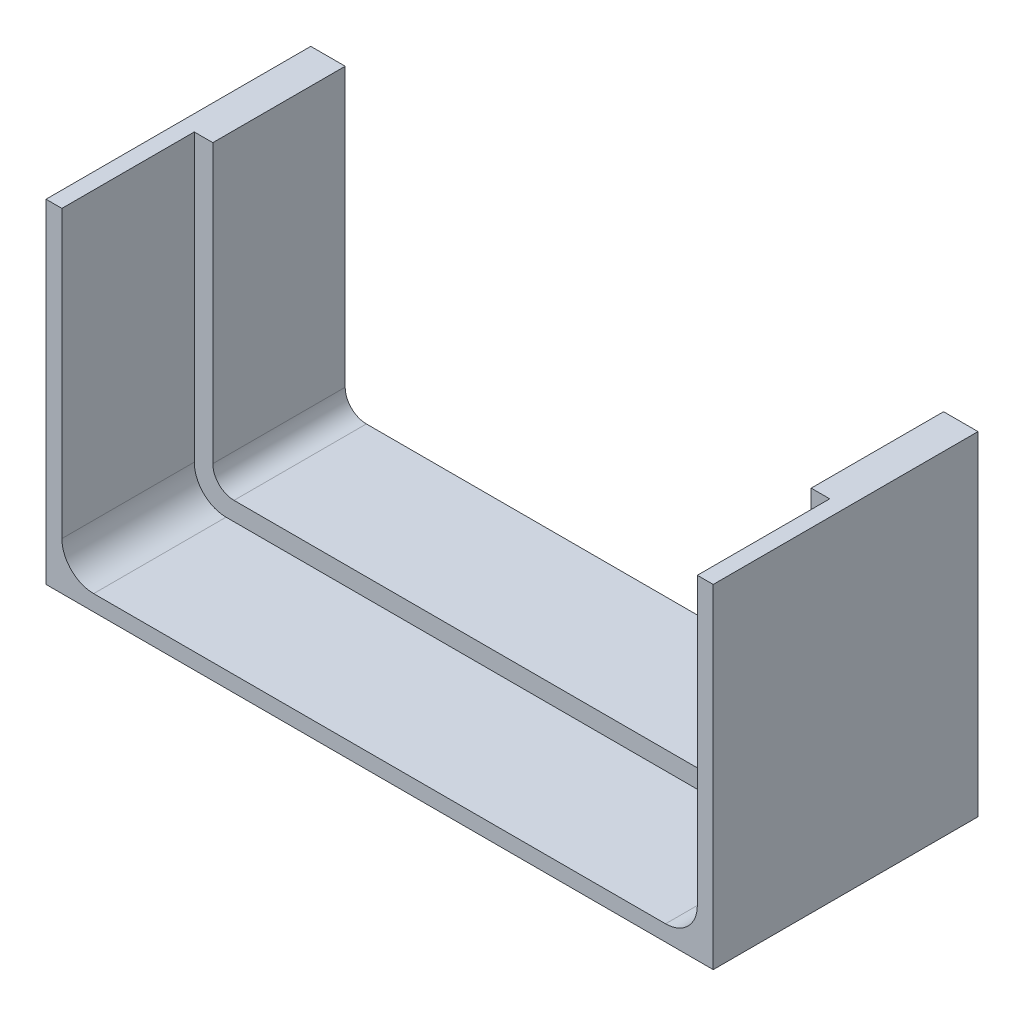
ISO-10303-21;
HEADER;
FILE_DESCRIPTION(('STEP AP214'),'2;1');
FILE_NAME('part.step','',(''),(''),'','','');
FILE_SCHEMA(('AUTOMOTIVE_DESIGN { 1 0 10303 214 1 1 1 1 }'));
ENDSEC;
DATA;
#1=APPLICATION_CONTEXT('core data for automotive mechanical design processes');
#2=APPLICATION_PROTOCOL_DEFINITION('international standard','automotive_design',2000,#1);
#3=PRODUCT_CONTEXT('',#1,'mechanical');
#4=PRODUCT('Part','Part','',(#3));
#5=PRODUCT_RELATED_PRODUCT_CATEGORY('part','',(#4));
#6=PRODUCT_DEFINITION_FORMATION('','',#4);
#7=PRODUCT_DEFINITION_CONTEXT('part definition',#1,'design');
#8=PRODUCT_DEFINITION('design','',#6,#7);
#9=PRODUCT_DEFINITION_SHAPE('','',#8);
#10=(LENGTH_UNIT() NAMED_UNIT(*) SI_UNIT(.MILLI.,.METRE.));
#11=(NAMED_UNIT(*) PLANE_ANGLE_UNIT() SI_UNIT($,.RADIAN.));
#12=(NAMED_UNIT(*) SI_UNIT($,.STERADIAN.) SOLID_ANGLE_UNIT());
#13=UNCERTAINTY_MEASURE_WITH_UNIT(LENGTH_MEASURE(1.E-05),#10,'distance_accuracy_value','');
#14=(GEOMETRIC_REPRESENTATION_CONTEXT(3) GLOBAL_UNCERTAINTY_ASSIGNED_CONTEXT((#13)) GLOBAL_UNIT_ASSIGNED_CONTEXT((#10,
#11,#12)) REPRESENTATION_CONTEXT('',''));
#15=CARTESIAN_POINT('',(0.,0.,0.));
#16=DIRECTION('',(0.,0.,1.));
#17=DIRECTION('',(1.,0.,0.));
#18=AXIS2_PLACEMENT_3D('',#15,#16,#17);
#19=CARTESIAN_POINT('',(-62.9999999999999,-63.,25.));
#20=DIRECTION('',(1.,0.,0.));
#21=DIRECTION('',(0.,0.,-1.));
#22=AXIS2_PLACEMENT_3D('',#19,#20,#21);
#23=PLANE('',#22);
#24=DIRECTION('',(0.,0.,-1.));
#25=VECTOR('',#24,1.);
#26=CARTESIAN_POINT('',(-62.9999999999999,0.,25.));
#27=LINE('',#26,#25);
#28=CARTESIAN_POINT('',(-62.9999999999999,0.,25.));
#29=VERTEX_POINT('',#28);
#30=CARTESIAN_POINT('',(-62.9999999999999,0.,-25.));
#31=VERTEX_POINT('',#30);
#32=EDGE_CURVE('E162',#29,#31,#27,.T.);
#33=ORIENTED_EDGE('',*,*,#32,.T.);
#34=DIRECTION('',(0.,1.,0.));
#35=VECTOR('',#34,1.);
#36=CARTESIAN_POINT('',(-62.9999999999999,-63.,-25.));
#37=LINE('',#36,#35);
#38=CARTESIAN_POINT('',(-62.9999999999999,-63.,-25.));
#39=VERTEX_POINT('',#38);
#40=EDGE_CURVE('E160',#39,#31,#37,.T.);
#41=ORIENTED_EDGE('',*,*,#40,.F.);
#42=DIRECTION('',(0.,0.,-1.));
#43=VECTOR('',#42,1.);
#44=CARTESIAN_POINT('',(-62.9999999999999,-63.,25.));
#45=LINE('',#44,#43);
#46=CARTESIAN_POINT('',(-62.9999999999999,-63.,25.));
#47=VERTEX_POINT('',#46);
#48=EDGE_CURVE('E146',#47,#39,#45,.T.);
#49=ORIENTED_EDGE('',*,*,#48,.F.);
#50=DIRECTION('',(0.,-1.,0.));
#51=VECTOR('',#50,1.);
#52=CARTESIAN_POINT('',(-62.9999999999999,-63.,25.));
#53=LINE('',#52,#51);
#54=EDGE_CURVE('E204',#29,#47,#53,.T.);
#55=ORIENTED_EDGE('',*,*,#54,.F.);
#56=EDGE_LOOP('',(#33,#41,#49,#55));
#57=FACE_BOUND('',#56,.T.);
#58=ADVANCED_FACE('F33',(#57),#23,.F.);
#59=CARTESIAN_POINT('',(62.9999999999999,-63.,25.));
#60=DIRECTION('',(0.,1.,0.));
#61=DIRECTION('',(-1.,0.,0.));
#62=AXIS2_PLACEMENT_3D('',#59,#60,#61);
#63=PLANE('',#62);
#64=ORIENTED_EDGE('',*,*,#48,.T.);
#65=DIRECTION('',(-1.,0.,0.));
#66=VECTOR('',#65,1.);
#67=CARTESIAN_POINT('',(62.9999999999999,-63.,-25.));
#68=LINE('',#67,#66);
#69=CARTESIAN_POINT('',(62.9999999999999,-63.,-25.));
#70=VERTEX_POINT('',#69);
#71=EDGE_CURVE('E151',#70,#39,#68,.T.);
#72=ORIENTED_EDGE('',*,*,#71,.F.);
#73=DIRECTION('',(0.,0.,-1.));
#74=VECTOR('',#73,1.);
#75=CARTESIAN_POINT('',(62.9999999999999,-63.,25.));
#76=LINE('',#75,#74);
#77=CARTESIAN_POINT('',(62.9999999999999,-63.,25.));
#78=VERTEX_POINT('',#77);
#79=EDGE_CURVE('E157',#78,#70,#76,.T.);
#80=ORIENTED_EDGE('',*,*,#79,.F.);
#81=DIRECTION('',(1.,0.,0.));
#82=VECTOR('',#81,1.);
#83=CARTESIAN_POINT('',(62.9999999999999,-63.,25.));
#84=LINE('',#83,#82);
#85=EDGE_CURVE('E152',#47,#78,#84,.T.);
#86=ORIENTED_EDGE('',*,*,#85,.F.);
#87=EDGE_LOOP('',(#64,#72,#80,#86));
#88=FACE_BOUND('',#87,.T.);
#89=ADVANCED_FACE('F148',(#88),#63,.F.);
#90=CARTESIAN_POINT('',(62.9999999999999,0.,25.));
#91=DIRECTION('',(-1.,0.,0.));
#92=DIRECTION('',(0.,-1.,0.));
#93=AXIS2_PLACEMENT_3D('',#90,#91,#92);
#94=PLANE('',#93);
#95=ORIENTED_EDGE('',*,*,#79,.T.);
#96=DIRECTION('',(0.,-1.,0.));
#97=VECTOR('',#96,1.);
#98=CARTESIAN_POINT('',(62.9999999999999,0.,-25.));
#99=LINE('',#98,#97);
#100=CARTESIAN_POINT('',(62.9999999999999,0.,-25.));
#101=VERTEX_POINT('',#100);
#102=EDGE_CURVE('E171',#101,#70,#99,.T.);
#103=ORIENTED_EDGE('',*,*,#102,.F.);
#104=DIRECTION('',(0.,0.,-1.));
#105=VECTOR('',#104,1.);
#106=CARTESIAN_POINT('',(62.9999999999999,0.,25.));
#107=LINE('',#106,#105);
#108=CARTESIAN_POINT('',(62.9999999999999,0.,25.));
#109=VERTEX_POINT('',#108);
#110=EDGE_CURVE('E236',#109,#101,#107,.T.);
#111=ORIENTED_EDGE('',*,*,#110,.F.);
#112=DIRECTION('',(0.,1.,0.));
#113=VECTOR('',#112,1.);
#114=CARTESIAN_POINT('',(62.9999999999999,0.,25.));
#115=LINE('',#114,#113);
#116=EDGE_CURVE('E208',#78,#109,#115,.T.);
#117=ORIENTED_EDGE('',*,*,#116,.F.);
#118=EDGE_LOOP('',(#95,#103,#111,#117));
#119=FACE_BOUND('',#118,.T.);
#120=ADVANCED_FACE('F322',(#119),#94,.F.);
#121=CARTESIAN_POINT('',(60.,0.,25.));
#122=DIRECTION('',(0.,-1.,0.));
#123=DIRECTION('',(1.,0.,0.));
#124=AXIS2_PLACEMENT_3D('',#121,#122,#123);
#125=PLANE('',#124);
#126=ORIENTED_EDGE('',*,*,#110,.T.);
#127=DIRECTION('',(1.,0.,0.));
#128=VECTOR('',#127,1.);
#129=CARTESIAN_POINT('',(56.4999999999999,0.,-25.));
#130=LINE('',#129,#128);
#131=CARTESIAN_POINT('',(56.4999999999999,0.,-25.));
#132=VERTEX_POINT('',#131);
#133=EDGE_CURVE('E186',#132,#101,#130,.T.);
#134=ORIENTED_EDGE('',*,*,#133,.F.);
#135=DIRECTION('',(0.,0.,1.));
#136=VECTOR('',#135,1.);
#137=CARTESIAN_POINT('',(56.4999999999999,0.,-25.));
#138=LINE('',#137,#136);
#139=CARTESIAN_POINT('',(56.4999999999999,0.,0.));
#140=VERTEX_POINT('',#139);
#141=EDGE_CURVE('E189',#132,#140,#138,.T.);
#142=ORIENTED_EDGE('',*,*,#141,.T.);
#143=DIRECTION('',(1.,0.,0.));
#144=VECTOR('',#143,1.);
#145=CARTESIAN_POINT('',(56.4999999999999,0.,0.));
#146=LINE('',#145,#144);
#147=CARTESIAN_POINT('',(60.,0.,0.));
#148=VERTEX_POINT('',#147);
#149=EDGE_CURVE('E172',#140,#148,#146,.T.);
#150=ORIENTED_EDGE('',*,*,#149,.T.);
#151=DIRECTION('',(0.,0.,-1.));
#152=VECTOR('',#151,1.);
#153=CARTESIAN_POINT('',(60.,0.,25.));
#154=LINE('',#153,#152);
#155=CARTESIAN_POINT('',(60.,0.,25.));
#156=VERTEX_POINT('',#155);
#157=EDGE_CURVE('E233',#156,#148,#154,.T.);
#158=ORIENTED_EDGE('',*,*,#157,.F.);
#159=DIRECTION('',(-1.,0.,0.));
#160=VECTOR('',#159,1.);
#161=CARTESIAN_POINT('',(60.,0.,25.));
#162=LINE('',#161,#160);
#163=EDGE_CURVE('E210',#109,#156,#162,.T.);
#164=ORIENTED_EDGE('',*,*,#163,.F.);
#165=EDGE_LOOP('',(#126,#134,#142,#150,#158,#164));
#166=FACE_BOUND('',#165,.T.);
#167=ADVANCED_FACE('F319',(#166),#125,.F.);
#168=CARTESIAN_POINT('',(60.,-60.,25.));
#169=DIRECTION('',(1.,0.,0.));
#170=DIRECTION('',(0.,1.,0.));
#171=AXIS2_PLACEMENT_3D('',#168,#169,#170);
#172=PLANE('',#171);
#173=DIRECTION('',(0.,-1.,0.));
#174=VECTOR('',#173,1.);
#175=CARTESIAN_POINT('',(60.,-60.,0.));
#176=LINE('',#175,#174);
#177=CARTESIAN_POINT('',(60.,-54.,0.));
#178=VERTEX_POINT('',#177);
#179=EDGE_CURVE('E203',#148,#178,#176,.T.);
#180=ORIENTED_EDGE('',*,*,#179,.T.);
#181=DIRECTION('',(0.,0.,-1.));
#182=VECTOR('',#181,1.);
#183=CARTESIAN_POINT('',(60.,-54.,25.));
#184=LINE('',#183,#182);
#185=CARTESIAN_POINT('',(60.,-54.,25.));
#186=VERTEX_POINT('',#185);
#187=EDGE_CURVE('E243',#178,#186,#184,.F.);
#188=ORIENTED_EDGE('',*,*,#187,.T.);
#189=DIRECTION('',(0.,-1.,0.));
#190=VECTOR('',#189,1.);
#191=CARTESIAN_POINT('',(60.,-60.,25.));
#192=LINE('',#191,#190);
#193=EDGE_CURVE('E212',#156,#186,#192,.T.);
#194=ORIENTED_EDGE('',*,*,#193,.F.);
#195=ORIENTED_EDGE('',*,*,#157,.T.);
#196=EDGE_LOOP('',(#180,#188,#194,#195));
#197=FACE_BOUND('',#196,.T.);
#198=ADVANCED_FACE('F314',(#197),#172,.F.);
#199=CARTESIAN_POINT('',(-60.,-60.,25.));
#200=DIRECTION('',(0.,-1.,0.));
#201=DIRECTION('',(1.,0.,0.));
#202=AXIS2_PLACEMENT_3D('',#199,#200,#201);
#203=PLANE('',#202);
#204=DIRECTION('',(-1.,0.,0.));
#205=VECTOR('',#204,1.);
#206=CARTESIAN_POINT('',(-60.,-60.,25.));
#207=LINE('',#206,#205);
#208=CARTESIAN_POINT('',(54.,-60.,25.));
#209=VERTEX_POINT('',#208);
#210=CARTESIAN_POINT('',(-54.,-60.,25.));
#211=VERTEX_POINT('',#210);
#212=EDGE_CURVE('E215',#209,#211,#207,.T.);
#213=ORIENTED_EDGE('',*,*,#212,.F.);
#214=DIRECTION('',(0.,0.,-1.));
#215=VECTOR('',#214,1.);
#216=CARTESIAN_POINT('',(54.,-60.,0.));
#217=LINE('',#216,#215);
#218=CARTESIAN_POINT('',(54.,-60.,0.));
#219=VERTEX_POINT('',#218);
#220=EDGE_CURVE('E240',#209,#219,#217,.T.);
#221=ORIENTED_EDGE('',*,*,#220,.T.);
#222=DIRECTION('',(-1.,0.,0.));
#223=VECTOR('',#222,1.);
#224=CARTESIAN_POINT('',(-60.,-60.,0.));
#225=LINE('',#224,#223);
#226=CARTESIAN_POINT('',(-54.,-60.,0.));
#227=VERTEX_POINT('',#226);
#228=EDGE_CURVE('E224',#219,#227,#225,.T.);
#229=ORIENTED_EDGE('',*,*,#228,.T.);
#230=DIRECTION('',(0.,0.,-1.));
#231=VECTOR('',#230,1.);
#232=CARTESIAN_POINT('',(-54.,-60.,25.));
#233=LINE('',#232,#231);
#234=EDGE_CURVE('E156',#227,#211,#233,.F.);
#235=ORIENTED_EDGE('',*,*,#234,.T.);
#236=EDGE_LOOP('',(#213,#221,#229,#235));
#237=FACE_BOUND('',#236,.T.);
#238=ADVANCED_FACE('F307',(#237),#203,.F.);
#239=CARTESIAN_POINT('',(-60.,0.,25.));
#240=DIRECTION('',(-1.,0.,0.));
#241=DIRECTION('',(0.,-1.,0.));
#242=AXIS2_PLACEMENT_3D('',#239,#240,#241);
#243=PLANE('',#242);
#244=DIRECTION('',(0.,1.,0.));
#245=VECTOR('',#244,1.);
#246=CARTESIAN_POINT('',(-60.,0.,25.));
#247=LINE('',#246,#245);
#248=CARTESIAN_POINT('',(-60.,-54.,25.));
#249=VERTEX_POINT('',#248);
#250=CARTESIAN_POINT('',(-60.,0.,25.));
#251=VERTEX_POINT('',#250);
#252=EDGE_CURVE('E218',#249,#251,#247,.T.);
#253=ORIENTED_EDGE('',*,*,#252,.F.);
#254=DIRECTION('',(0.,0.,-1.));
#255=VECTOR('',#254,1.);
#256=CARTESIAN_POINT('',(-60.,-54.,0.));
#257=LINE('',#256,#255);
#258=CARTESIAN_POINT('',(-60.,-54.,0.));
#259=VERTEX_POINT('',#258);
#260=EDGE_CURVE('E245',#249,#259,#257,.T.);
#261=ORIENTED_EDGE('',*,*,#260,.T.);
#262=DIRECTION('',(0.,1.,0.));
#263=VECTOR('',#262,1.);
#264=CARTESIAN_POINT('',(-60.,0.,0.));
#265=LINE('',#264,#263);
#266=CARTESIAN_POINT('',(-60.,0.,0.));
#267=VERTEX_POINT('',#266);
#268=EDGE_CURVE('E206',#259,#267,#265,.T.);
#269=ORIENTED_EDGE('',*,*,#268,.T.);
#270=DIRECTION('',(0.,0.,-1.));
#271=VECTOR('',#270,1.);
#272=CARTESIAN_POINT('',(-60.,0.,25.));
#273=LINE('',#272,#271);
#274=EDGE_CURVE('E230',#251,#267,#273,.T.);
#275=ORIENTED_EDGE('',*,*,#274,.F.);
#276=EDGE_LOOP('',(#253,#261,#269,#275));
#277=FACE_BOUND('',#276,.T.);
#278=ADVANCED_FACE('F294',(#277),#243,.F.);
#279=CARTESIAN_POINT('',(-62.9999999999999,0.,25.));
#280=DIRECTION('',(0.,-1.,0.));
#281=DIRECTION('',(0.,0.,-1.));
#282=AXIS2_PLACEMENT_3D('',#279,#280,#281);
#283=PLANE('',#282);
#284=ORIENTED_EDGE('',*,*,#274,.T.);
#285=DIRECTION('',(1.,0.,0.));
#286=VECTOR('',#285,1.);
#287=CARTESIAN_POINT('',(-62.9999999999999,0.,0.));
#288=LINE('',#287,#286);
#289=CARTESIAN_POINT('',(-56.4999999999999,0.,0.));
#290=VERTEX_POINT('',#289);
#291=EDGE_CURVE('E190',#267,#290,#288,.T.);
#292=ORIENTED_EDGE('',*,*,#291,.T.);
#293=DIRECTION('',(0.,0.,1.));
#294=VECTOR('',#293,1.);
#295=CARTESIAN_POINT('',(-56.4999999999999,0.,-25.));
#296=LINE('',#295,#294);
#297=CARTESIAN_POINT('',(-56.4999999999999,0.,-25.));
#298=VERTEX_POINT('',#297);
#299=EDGE_CURVE('E200',#298,#290,#296,.T.);
#300=ORIENTED_EDGE('',*,*,#299,.F.);
#301=DIRECTION('',(1.,0.,0.));
#302=VECTOR('',#301,1.);
#303=CARTESIAN_POINT('',(-62.9999999999999,0.,-25.));
#304=LINE('',#303,#302);
#305=EDGE_CURVE('E165',#31,#298,#304,.T.);
#306=ORIENTED_EDGE('',*,*,#305,.F.);
#307=ORIENTED_EDGE('',*,*,#32,.F.);
#308=DIRECTION('',(-1.,0.,0.));
#309=VECTOR('',#308,1.);
#310=CARTESIAN_POINT('',(-62.9999999999999,0.,25.));
#311=LINE('',#310,#309);
#312=EDGE_CURVE('E220',#251,#29,#311,.T.);
#313=ORIENTED_EDGE('',*,*,#312,.F.);
#314=EDGE_LOOP('',(#284,#292,#300,#306,#307,#313));
#315=FACE_BOUND('',#314,.T.);
#316=ADVANCED_FACE('F297',(#315),#283,.F.);
#317=CARTESIAN_POINT('',(0.,0.,25.));
#318=DIRECTION('',(0.,0.,-1.));
#319=DIRECTION('',(-1.,0.,0.));
#320=AXIS2_PLACEMENT_3D('',#317,#318,#319);
#321=PLANE('',#320);
#322=ORIENTED_EDGE('',*,*,#54,.T.);
#323=ORIENTED_EDGE('',*,*,#85,.T.);
#324=ORIENTED_EDGE('',*,*,#116,.T.);
#325=ORIENTED_EDGE('',*,*,#163,.T.);
#326=ORIENTED_EDGE('',*,*,#193,.T.);
#327=CARTESIAN_POINT('',(54.,-54.,25.));
#328=DIRECTION('',(0.,0.,-1.));
#329=DIRECTION('',(-1.,0.,0.));
#330=AXIS2_PLACEMENT_3D('',#327,#328,#329);
#331=CIRCLE('',#330,6.);
#332=EDGE_CURVE('E250',#186,#209,#331,.T.);
#333=ORIENTED_EDGE('',*,*,#332,.T.);
#334=ORIENTED_EDGE('',*,*,#212,.T.);
#335=CARTESIAN_POINT('',(-54.,-54.,25.));
#336=DIRECTION('',(0.,0.,-1.));
#337=DIRECTION('',(-1.,0.,0.));
#338=AXIS2_PLACEMENT_3D('',#335,#336,#337);
#339=CIRCLE('',#338,6.);
#340=EDGE_CURVE('E254',#211,#249,#339,.T.);
#341=ORIENTED_EDGE('',*,*,#340,.T.);
#342=ORIENTED_EDGE('',*,*,#252,.T.);
#343=ORIENTED_EDGE('',*,*,#312,.T.);
#344=EDGE_LOOP('',(#322,#323,#324,#325,#326,#333,#334,#341,#342,#343));
#345=FACE_BOUND('',#344,.T.);
#346=ADVANCED_FACE('F299',(#345),#321,.F.);
#347=CARTESIAN_POINT('',(54.,-54.,25.));
#348=DIRECTION('',(0.,0.,1.));
#349=DIRECTION('',(1.,0.,0.));
#350=AXIS2_PLACEMENT_3D('',#347,#348,#349);
#351=CYLINDRICAL_SURFACE('',#350,6.);
#352=ORIENTED_EDGE('',*,*,#332,.F.);
#353=ORIENTED_EDGE('',*,*,#187,.F.);
#354=CARTESIAN_POINT('',(54.,-54.,0.));
#355=DIRECTION('',(0.,0.,-1.));
#356=DIRECTION('',(-1.,0.,0.));
#357=AXIS2_PLACEMENT_3D('',#354,#355,#356);
#358=CIRCLE('',#357,6.);
#359=EDGE_CURVE('E248',#219,#178,#358,.F.);
#360=ORIENTED_EDGE('',*,*,#359,.F.);
#361=ORIENTED_EDGE('',*,*,#220,.F.);
#362=EDGE_LOOP('',(#352,#353,#360,#361));
#363=FACE_BOUND('',#362,.T.);
#364=ADVANCED_FACE('F311',(#363),#351,.F.);
#365=CARTESIAN_POINT('',(-54.,-54.,25.));
#366=DIRECTION('',(0.,0.,1.));
#367=DIRECTION('',(1.,0.,0.));
#368=AXIS2_PLACEMENT_3D('',#365,#366,#367);
#369=CYLINDRICAL_SURFACE('',#368,6.);
#370=ORIENTED_EDGE('',*,*,#340,.F.);
#371=ORIENTED_EDGE('',*,*,#234,.F.);
#372=CARTESIAN_POINT('',(-54.,-54.,0.));
#373=DIRECTION('',(0.,0.,-1.));
#374=DIRECTION('',(-1.,0.,0.));
#375=AXIS2_PLACEMENT_3D('',#372,#373,#374);
#376=CIRCLE('',#375,6.);
#377=EDGE_CURVE('E252',#259,#227,#376,.F.);
#378=ORIENTED_EDGE('',*,*,#377,.F.);
#379=ORIENTED_EDGE('',*,*,#260,.F.);
#380=EDGE_LOOP('',(#370,#371,#378,#379));
#381=FACE_BOUND('',#380,.T.);
#382=ADVANCED_FACE('F302',(#381),#369,.F.);
#383=CARTESIAN_POINT('',(-56.4999999999999,0.,-25.));
#384=DIRECTION('',(-1.,0.,0.));
#385=DIRECTION('',(0.,-1.,0.));
#386=AXIS2_PLACEMENT_3D('',#383,#384,#385);
#387=PLANE('',#386);
#388=DIRECTION('',(0.,-1.,0.));
#389=VECTOR('',#388,1.);
#390=CARTESIAN_POINT('',(-56.4999999999999,0.,0.));
#391=LINE('',#390,#389);
#392=CARTESIAN_POINT('',(-56.5,-52.5,0.));
#393=VERTEX_POINT('',#392);
#394=EDGE_CURVE('E192',#290,#393,#391,.T.);
#395=ORIENTED_EDGE('',*,*,#394,.T.);
#396=DIRECTION('',(0.,0.,1.));
#397=VECTOR('',#396,1.);
#398=CARTESIAN_POINT('',(-56.5,-52.5,-25.));
#399=LINE('',#398,#397);
#400=CARTESIAN_POINT('',(-56.5,-52.5,-25.));
#401=VERTEX_POINT('',#400);
#402=EDGE_CURVE('E48',#393,#401,#399,.F.);
#403=ORIENTED_EDGE('',*,*,#402,.T.);
#404=DIRECTION('',(0.,-1.,0.));
#405=VECTOR('',#404,1.);
#406=CARTESIAN_POINT('',(-56.4999999999999,0.,-25.));
#407=LINE('',#406,#405);
#408=EDGE_CURVE('E179',#298,#401,#407,.T.);
#409=ORIENTED_EDGE('',*,*,#408,.F.);
#410=ORIENTED_EDGE('',*,*,#299,.T.);
#411=EDGE_LOOP('',(#395,#403,#409,#410));
#412=FACE_BOUND('',#411,.T.);
#413=ADVANCED_FACE('F288',(#412),#387,.F.);
#414=CARTESIAN_POINT('',(-56.5,-56.5,-25.));
#415=DIRECTION('',(0.,-1.,0.));
#416=DIRECTION('',(1.,0.,0.));
#417=AXIS2_PLACEMENT_3D('',#414,#415,#416);
#418=PLANE('',#417);
#419=DIRECTION('',(1.,0.,0.));
#420=VECTOR('',#419,1.);
#421=CARTESIAN_POINT('',(-56.5,-56.5,0.));
#422=LINE('',#421,#420);
#423=CARTESIAN_POINT('',(-52.5,-56.5,0.));
#424=VERTEX_POINT('',#423);
#425=CARTESIAN_POINT('',(52.4999999999999,-56.5,0.));
#426=VERTEX_POINT('',#425);
#427=EDGE_CURVE('E194',#424,#426,#422,.T.);
#428=ORIENTED_EDGE('',*,*,#427,.T.);
#429=DIRECTION('',(0.,0.,1.));
#430=VECTOR('',#429,1.);
#431=CARTESIAN_POINT('',(52.4999999999999,-56.5,-25.));
#432=LINE('',#431,#430);
#433=CARTESIAN_POINT('',(52.4999999999999,-56.5,-25.));
#434=VERTEX_POINT('',#433);
#435=EDGE_CURVE('E262',#426,#434,#432,.F.);
#436=ORIENTED_EDGE('',*,*,#435,.T.);
#437=DIRECTION('',(1.,0.,0.));
#438=VECTOR('',#437,1.);
#439=CARTESIAN_POINT('',(-56.5,-56.5,-25.));
#440=LINE('',#439,#438);
#441=CARTESIAN_POINT('',(-52.5,-56.5,-25.));
#442=VERTEX_POINT('',#441);
#443=EDGE_CURVE('E181',#442,#434,#440,.T.);
#444=ORIENTED_EDGE('',*,*,#443,.F.);
#445=DIRECTION('',(0.,0.,1.));
#446=VECTOR('',#445,1.);
#447=CARTESIAN_POINT('',(-52.5,-56.5,0.));
#448=LINE('',#447,#446);
#449=EDGE_CURVE('E259',#442,#424,#448,.T.);
#450=ORIENTED_EDGE('',*,*,#449,.T.);
#451=EDGE_LOOP('',(#428,#436,#444,#450));
#452=FACE_BOUND('',#451,.T.);
#453=ADVANCED_FACE('F283',(#452),#418,.F.);
#454=CARTESIAN_POINT('',(56.4999999999999,-56.5,-25.));
#455=DIRECTION('',(1.,0.,0.));
#456=DIRECTION('',(0.,1.,0.));
#457=AXIS2_PLACEMENT_3D('',#454,#455,#456);
#458=PLANE('',#457);
#459=DIRECTION('',(0.,1.,0.));
#460=VECTOR('',#459,1.);
#461=CARTESIAN_POINT('',(56.4999999999999,-56.5,-25.));
#462=LINE('',#461,#460);
#463=CARTESIAN_POINT('',(56.4999999999999,-52.5,-25.));
#464=VERTEX_POINT('',#463);
#465=EDGE_CURVE('E184',#464,#132,#462,.T.);
#466=ORIENTED_EDGE('',*,*,#465,.F.);
#467=DIRECTION('',(0.,0.,1.));
#468=VECTOR('',#467,1.);
#469=CARTESIAN_POINT('',(56.4999999999999,-52.5,0.));
#470=LINE('',#469,#468);
#471=CARTESIAN_POINT('',(56.4999999999999,-52.5,0.));
#472=VERTEX_POINT('',#471);
#473=EDGE_CURVE('E256',#464,#472,#470,.T.);
#474=ORIENTED_EDGE('',*,*,#473,.T.);
#475=DIRECTION('',(0.,1.,0.));
#476=VECTOR('',#475,1.);
#477=CARTESIAN_POINT('',(56.4999999999999,-56.5,0.));
#478=LINE('',#477,#476);
#479=EDGE_CURVE('E175',#472,#140,#478,.T.);
#480=ORIENTED_EDGE('',*,*,#479,.T.);
#481=ORIENTED_EDGE('',*,*,#141,.F.);
#482=EDGE_LOOP('',(#466,#474,#480,#481));
#483=FACE_BOUND('',#482,.T.);
#484=ADVANCED_FACE('F276',(#483),#458,.F.);
#485=CARTESIAN_POINT('',(0.,0.,-25.));
#486=DIRECTION('',(0.,0.,-1.));
#487=DIRECTION('',(-1.,0.,0.));
#488=AXIS2_PLACEMENT_3D('',#485,#486,#487);
#489=PLANE('',#488);
#490=ORIENTED_EDGE('',*,*,#71,.T.);
#491=ORIENTED_EDGE('',*,*,#40,.T.);
#492=ORIENTED_EDGE('',*,*,#305,.T.);
#493=ORIENTED_EDGE('',*,*,#408,.T.);
#494=CARTESIAN_POINT('',(-52.5,-52.5,-25.));
#495=DIRECTION('',(0.,0.,-1.));
#496=DIRECTION('',(-1.,0.,0.));
#497=AXIS2_PLACEMENT_3D('',#494,#495,#496);
#498=CIRCLE('',#497,4.);
#499=EDGE_CURVE('E11',#401,#442,#498,.F.);
#500=ORIENTED_EDGE('',*,*,#499,.T.);
#501=ORIENTED_EDGE('',*,*,#443,.T.);
#502=CARTESIAN_POINT('',(52.4999999999999,-52.5,-25.));
#503=DIRECTION('',(0.,0.,-1.));
#504=DIRECTION('',(-1.,0.,0.));
#505=AXIS2_PLACEMENT_3D('',#502,#503,#504);
#506=CIRCLE('',#505,4.);
#507=EDGE_CURVE('E267',#434,#464,#506,.F.);
#508=ORIENTED_EDGE('',*,*,#507,.T.);
#509=ORIENTED_EDGE('',*,*,#465,.T.);
#510=ORIENTED_EDGE('',*,*,#133,.T.);
#511=ORIENTED_EDGE('',*,*,#102,.T.);
#512=EDGE_LOOP('',(#490,#491,#492,#493,#500,#501,#508,#509,#510,#511));
#513=FACE_BOUND('',#512,.T.);
#514=ADVANCED_FACE('F168',(#513),#489,.T.);
#515=CARTESIAN_POINT('',(0.,0.,0.));
#516=DIRECTION('',(0.,0.,-1.));
#517=DIRECTION('',(-1.,0.,0.));
#518=AXIS2_PLACEMENT_3D('',#515,#516,#517);
#519=PLANE('',#518);
#520=ORIENTED_EDGE('',*,*,#268,.F.);
#521=ORIENTED_EDGE('',*,*,#377,.T.);
#522=ORIENTED_EDGE('',*,*,#228,.F.);
#523=ORIENTED_EDGE('',*,*,#359,.T.);
#524=ORIENTED_EDGE('',*,*,#179,.F.);
#525=ORIENTED_EDGE('',*,*,#149,.F.);
#526=ORIENTED_EDGE('',*,*,#479,.F.);
#527=CARTESIAN_POINT('',(52.4999999999999,-52.5,0.));
#528=DIRECTION('',(0.,0.,-1.));
#529=DIRECTION('',(-1.,0.,0.));
#530=AXIS2_PLACEMENT_3D('',#527,#528,#529);
#531=CIRCLE('',#530,4.);
#532=EDGE_CURVE('E265',#472,#426,#531,.T.);
#533=ORIENTED_EDGE('',*,*,#532,.T.);
#534=ORIENTED_EDGE('',*,*,#427,.F.);
#535=CARTESIAN_POINT('',(-52.5,-52.5,0.));
#536=DIRECTION('',(0.,0.,-1.));
#537=DIRECTION('',(-1.,0.,0.));
#538=AXIS2_PLACEMENT_3D('',#535,#536,#537);
#539=CIRCLE('',#538,4.);
#540=EDGE_CURVE('E41',#424,#393,#539,.T.);
#541=ORIENTED_EDGE('',*,*,#540,.T.);
#542=ORIENTED_EDGE('',*,*,#394,.F.);
#543=ORIENTED_EDGE('',*,*,#291,.F.);
#544=EDGE_LOOP('',(#520,#521,#522,#523,#524,#525,#526,#533,#534,#541,#542,#543));
#545=FACE_BOUND('',#544,.T.);
#546=ADVANCED_FACE('F280',(#545),#519,.F.);
#547=CARTESIAN_POINT('',(52.4999999999999,-52.5,-25.));
#548=DIRECTION('',(0.,0.,-1.));
#549=DIRECTION('',(-1.,0.,0.));
#550=AXIS2_PLACEMENT_3D('',#547,#548,#549);
#551=CYLINDRICAL_SURFACE('',#550,4.);
#552=ORIENTED_EDGE('',*,*,#507,.F.);
#553=ORIENTED_EDGE('',*,*,#435,.F.);
#554=ORIENTED_EDGE('',*,*,#532,.F.);
#555=ORIENTED_EDGE('',*,*,#473,.F.);
#556=EDGE_LOOP('',(#552,#553,#554,#555));
#557=FACE_BOUND('',#556,.T.);
#558=ADVANCED_FACE('F279',(#557),#551,.F.);
#559=CARTESIAN_POINT('',(-52.5,-52.5,-25.));
#560=DIRECTION('',(0.,0.,-1.));
#561=DIRECTION('',(-1.,0.,0.));
#562=AXIS2_PLACEMENT_3D('',#559,#560,#561);
#563=CYLINDRICAL_SURFACE('',#562,4.);
#564=ORIENTED_EDGE('',*,*,#499,.F.);
#565=ORIENTED_EDGE('',*,*,#402,.F.);
#566=ORIENTED_EDGE('',*,*,#540,.F.);
#567=ORIENTED_EDGE('',*,*,#449,.F.);
#568=EDGE_LOOP('',(#564,#565,#566,#567));
#569=FACE_BOUND('',#568,.T.);
#570=ADVANCED_FACE('F35',(#569),#563,.F.);
#571=CLOSED_SHELL('',(#58,#89,#120,#167,#198,#238,#278,#316,#346,#364,#382,#413,#453,#484,#514,
#546,#558,#570));
#572=MANIFOLD_SOLID_BREP('B2',#571);
#573=ADVANCED_BREP_SHAPE_REPRESENTATION('',(#18,#572),#14);
#574=SHAPE_DEFINITION_REPRESENTATION(#9,#573);
ENDSEC;
END-ISO-10303-21;
